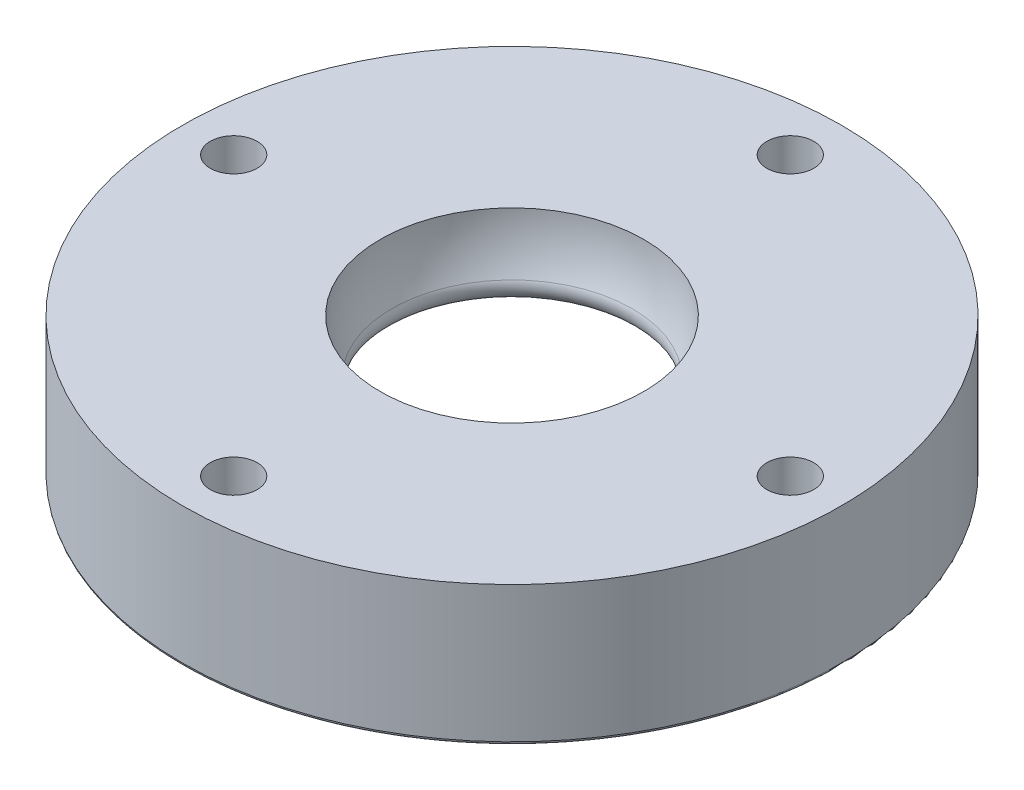
ISO-10303-21;
HEADER;
FILE_DESCRIPTION(('STEP AP214'),'2;1');
FILE_NAME('part.step','',(''),(''),'','','');
FILE_SCHEMA(('AUTOMOTIVE_DESIGN { 1 0 10303 214 1 1 1 1 }'));
ENDSEC;
DATA;
#1=APPLICATION_CONTEXT('core data for automotive mechanical design processes');
#2=APPLICATION_PROTOCOL_DEFINITION('international standard','automotive_design',2000,#1);
#3=PRODUCT_CONTEXT('',#1,'mechanical');
#4=PRODUCT('Part','Part','',(#3));
#5=PRODUCT_RELATED_PRODUCT_CATEGORY('part','',(#4));
#6=PRODUCT_DEFINITION_FORMATION('','',#4);
#7=PRODUCT_DEFINITION_CONTEXT('part definition',#1,'design');
#8=PRODUCT_DEFINITION('design','',#6,#7);
#9=PRODUCT_DEFINITION_SHAPE('','',#8);
#10=(LENGTH_UNIT() NAMED_UNIT(*) SI_UNIT(.MILLI.,.METRE.));
#11=(NAMED_UNIT(*) PLANE_ANGLE_UNIT() SI_UNIT($,.RADIAN.));
#12=(NAMED_UNIT(*) SI_UNIT($,.STERADIAN.) SOLID_ANGLE_UNIT());
#13=UNCERTAINTY_MEASURE_WITH_UNIT(LENGTH_MEASURE(1.E-05),#10,'distance_accuracy_value','');
#14=(GEOMETRIC_REPRESENTATION_CONTEXT(3) GLOBAL_UNCERTAINTY_ASSIGNED_CONTEXT((#13)) GLOBAL_UNIT_ASSIGNED_CONTEXT((#10,
#11,#12)) REPRESENTATION_CONTEXT('',''));
#15=CARTESIAN_POINT('',(0.,0.,0.));
#16=DIRECTION('',(0.,0.,1.));
#17=DIRECTION('',(1.,0.,0.));
#18=AXIS2_PLACEMENT_3D('',#15,#16,#17);
#19=CARTESIAN_POINT('',(0.,0.,0.));
#20=DIRECTION('',(0.,-1.,0.));
#21=DIRECTION('',(-1.,0.,0.));
#22=AXIS2_PLACEMENT_3D('',#19,#20,#21);
#23=SPHERICAL_SURFACE('',#22,9.);
#24=CARTESIAN_POINT('',(0.,-3.69802060357378,0.));
#25=DIRECTION('',(0.,1.,0.));
#26=DIRECTION('',(0.,0.,1.));
#27=AXIS2_PLACEMENT_3D('',#24,#25,#26);
#28=CIRCLE('',#27,8.20515957282635);
#29=CARTESIAN_POINT('',(0.,-3.69802060357378,8.20515957282635));
#30=VERTEX_POINT('',#29);
#31=EDGE_CURVE('E41',#30,#30,#28,.F.);
#32=ORIENTED_EDGE('',*,*,#31,.T.);
#33=EDGE_LOOP('',(#32));
#34=FACE_BOUND('',#33,.T.);
#35=CARTESIAN_POINT('',(0.,0.,0.));
#36=DIRECTION('',(0.,-1.,0.));
#37=DIRECTION('',(0.,0.,-1.));
#38=AXIS2_PLACEMENT_3D('',#35,#36,#37);
#39=CIRCLE('',#38,9.);
#40=CARTESIAN_POINT('',(0.,0.,-9.));
#41=VERTEX_POINT('',#40);
#42=EDGE_CURVE('E84',#41,#41,#39,.T.);
#43=ORIENTED_EDGE('',*,*,#42,.F.);
#44=EDGE_LOOP('',(#43));
#45=FACE_BOUND('',#44,.T.);
#46=ADVANCED_FACE('F34',(#34,#45),#23,.F.);
#47=CARTESIAN_POINT('',(0.,0.,0.));
#48=DIRECTION('',(0.,1.,0.));
#49=DIRECTION('',(0.,0.,1.));
#50=AXIS2_PLACEMENT_3D('',#47,#48,#49);
#51=PLANE('',#50);
#52=CARTESIAN_POINT('',(0.,0.,19.));
#53=DIRECTION('',(0.,1.,0.));
#54=DIRECTION('',(0.,0.,1.));
#55=AXIS2_PLACEMENT_3D('',#52,#53,#54);
#56=CIRCLE('',#55,1.6);
#57=CARTESIAN_POINT('',(0.,0.,20.6));
#58=VERTEX_POINT('',#57);
#59=EDGE_CURVE('E99',#58,#58,#56,.T.);
#60=ORIENTED_EDGE('',*,*,#59,.F.);
#61=EDGE_LOOP('',(#60));
#62=FACE_BOUND('',#61,.T.);
#63=CARTESIAN_POINT('',(19.,0.,0.));
#64=DIRECTION('',(0.,1.,0.));
#65=DIRECTION('',(0.,0.,1.));
#66=AXIS2_PLACEMENT_3D('',#63,#64,#65);
#67=CIRCLE('',#66,1.6);
#68=CARTESIAN_POINT('',(19.,0.,1.6));
#69=VERTEX_POINT('',#68);
#70=EDGE_CURVE('E96',#69,#69,#67,.T.);
#71=ORIENTED_EDGE('',*,*,#70,.F.);
#72=EDGE_LOOP('',(#71));
#73=FACE_BOUND('',#72,.T.);
#74=CARTESIAN_POINT('',(0.,0.,-19.));
#75=DIRECTION('',(0.,1.,0.));
#76=DIRECTION('',(0.,0.,1.));
#77=AXIS2_PLACEMENT_3D('',#74,#75,#76);
#78=CIRCLE('',#77,1.6);
#79=CARTESIAN_POINT('',(0.,0.,-17.4));
#80=VERTEX_POINT('',#79);
#81=EDGE_CURVE('E93',#80,#80,#78,.T.);
#82=ORIENTED_EDGE('',*,*,#81,.F.);
#83=EDGE_LOOP('',(#82));
#84=FACE_BOUND('',#83,.T.);
#85=CARTESIAN_POINT('',(-19.,0.,0.));
#86=DIRECTION('',(0.,1.,0.));
#87=DIRECTION('',(0.,0.,1.));
#88=AXIS2_PLACEMENT_3D('',#85,#86,#87);
#89=CIRCLE('',#88,1.6);
#90=CARTESIAN_POINT('',(-19.,0.,1.6));
#91=VERTEX_POINT('',#90);
#92=EDGE_CURVE('E90',#91,#91,#89,.T.);
#93=ORIENTED_EDGE('',*,*,#92,.F.);
#94=EDGE_LOOP('',(#93));
#95=FACE_BOUND('',#94,.T.);
#96=ORIENTED_EDGE('',*,*,#42,.T.);
#97=EDGE_LOOP('',(#96));
#98=FACE_BOUND('',#97,.T.);
#99=CARTESIAN_POINT('',(0.,0.,0.));
#100=DIRECTION('',(0.,-1.,0.));
#101=DIRECTION('',(0.,0.,-1.));
#102=AXIS2_PLACEMENT_3D('',#99,#100,#101);
#103=CIRCLE('',#102,22.5);
#104=CARTESIAN_POINT('',(0.,0.,-22.5));
#105=VERTEX_POINT('',#104);
#106=EDGE_CURVE('E87',#105,#105,#103,.T.);
#107=ORIENTED_EDGE('',*,*,#106,.F.);
#108=EDGE_LOOP('',(#107));
#109=FACE_BOUND('',#108,.T.);
#110=ADVANCED_FACE('F105',(#62,#73,#84,#95,#98,#109),#51,.T.);
#111=CARTESIAN_POINT('',(0.,0.,0.));
#112=DIRECTION('',(0.,-1.,0.));
#113=DIRECTION('',(0.,0.,-1.));
#114=AXIS2_PLACEMENT_3D('',#111,#112,#113);
#115=CYLINDRICAL_SURFACE('',#114,22.5);
#116=CARTESIAN_POINT('',(0.,-9.29999999999998,0.));
#117=DIRECTION('',(0.,-1.,0.));
#118=DIRECTION('',(0.,0.,-1.));
#119=AXIS2_PLACEMENT_3D('',#116,#117,#118);
#120=CIRCLE('',#119,22.5);
#121=CARTESIAN_POINT('',(0.,-9.29999999999998,-22.5));
#122=VERTEX_POINT('',#121);
#123=EDGE_CURVE('E60',#122,#122,#120,.F.);
#124=ORIENTED_EDGE('',*,*,#123,.T.);
#125=EDGE_LOOP('',(#124));
#126=FACE_BOUND('',#125,.T.);
#127=ORIENTED_EDGE('',*,*,#106,.T.);
#128=EDGE_LOOP('',(#127));
#129=FACE_BOUND('',#128,.T.);
#130=ADVANCED_FACE('F108',(#126,#129),#115,.T.);
#131=CARTESIAN_POINT('',(0.,-9.49999999999998,0.));
#132=DIRECTION('',(0.,-1.,0.));
#133=DIRECTION('',(0.,0.,-1.));
#134=AXIS2_PLACEMENT_3D('',#131,#132,#133);
#135=PLANE('',#134);
#136=CARTESIAN_POINT('',(0.,-9.49999999999998,0.));
#137=DIRECTION('',(0.,-1.,0.));
#138=DIRECTION('',(0.,0.,-1.));
#139=AXIS2_PLACEMENT_3D('',#136,#137,#138);
#140=CIRCLE('',#139,16.5080725103906);
#141=CARTESIAN_POINT('',(0.,-9.49999999999998,-16.5080725103906));
#142=VERTEX_POINT('',#141);
#143=EDGE_CURVE('E63',#142,#142,#140,.F.);
#144=ORIENTED_EDGE('',*,*,#143,.T.);
#145=EDGE_LOOP('',(#144));
#146=FACE_BOUND('',#145,.T.);
#147=CARTESIAN_POINT('',(0.,-9.49999999999998,0.));
#148=DIRECTION('',(0.,-1.,0.));
#149=DIRECTION('',(0.,0.,-1.));
#150=AXIS2_PLACEMENT_3D('',#147,#148,#149);
#151=CIRCLE('',#150,22.3);
#152=CARTESIAN_POINT('',(0.,-9.49999999999998,-22.3));
#153=VERTEX_POINT('',#152);
#154=EDGE_CURVE('E66',#153,#153,#151,.T.);
#155=ORIENTED_EDGE('',*,*,#154,.T.);
#156=EDGE_LOOP('',(#155));
#157=FACE_BOUND('',#156,.T.);
#158=CARTESIAN_POINT('',(-19.,-9.49999999999998,0.));
#159=DIRECTION('',(0.,-1.,0.));
#160=DIRECTION('',(0.,0.,-1.));
#161=AXIS2_PLACEMENT_3D('',#158,#159,#160);
#162=CIRCLE('',#161,1.8);
#163=CARTESIAN_POINT('',(-19.,-9.49999999999998,-1.8));
#164=VERTEX_POINT('',#163);
#165=EDGE_CURVE('E69',#164,#164,#162,.F.);
#166=ORIENTED_EDGE('',*,*,#165,.T.);
#167=EDGE_LOOP('',(#166));
#168=FACE_BOUND('',#167,.T.);
#169=CARTESIAN_POINT('',(0.,-9.49999999999998,-19.));
#170=DIRECTION('',(0.,-1.,0.));
#171=DIRECTION('',(0.,0.,-1.));
#172=AXIS2_PLACEMENT_3D('',#169,#170,#171);
#173=CIRCLE('',#172,1.8);
#174=CARTESIAN_POINT('',(0.,-9.49999999999998,-20.8));
#175=VERTEX_POINT('',#174);
#176=EDGE_CURVE('E72',#175,#175,#173,.F.);
#177=ORIENTED_EDGE('',*,*,#176,.T.);
#178=EDGE_LOOP('',(#177));
#179=FACE_BOUND('',#178,.T.);
#180=CARTESIAN_POINT('',(19.,-9.49999999999998,0.));
#181=DIRECTION('',(0.,-1.,0.));
#182=DIRECTION('',(0.,0.,-1.));
#183=AXIS2_PLACEMENT_3D('',#180,#181,#182);
#184=CIRCLE('',#183,1.8);
#185=CARTESIAN_POINT('',(19.,-9.49999999999998,-1.8));
#186=VERTEX_POINT('',#185);
#187=EDGE_CURVE('E75',#186,#186,#184,.F.);
#188=ORIENTED_EDGE('',*,*,#187,.T.);
#189=EDGE_LOOP('',(#188));
#190=FACE_BOUND('',#189,.T.);
#191=CARTESIAN_POINT('',(0.,-9.49999999999998,19.));
#192=DIRECTION('',(0.,-1.,0.));
#193=DIRECTION('',(0.,0.,-1.));
#194=AXIS2_PLACEMENT_3D('',#191,#192,#193);
#195=CIRCLE('',#194,1.8);
#196=CARTESIAN_POINT('',(0.,-9.49999999999998,17.2));
#197=VERTEX_POINT('',#196);
#198=EDGE_CURVE('E78',#197,#197,#195,.F.);
#199=ORIENTED_EDGE('',*,*,#198,.T.);
#200=EDGE_LOOP('',(#199));
#201=FACE_BOUND('',#200,.T.);
#202=ADVANCED_FACE('F121',(#146,#157,#168,#179,#190,#201),#135,.T.);
#203=CARTESIAN_POINT('',(0.,-4.49999999999998,0.));
#204=DIRECTION('',(0.,-1.,0.));
#205=DIRECTION('',(0.,0.,-1.));
#206=AXIS2_PLACEMENT_3D('',#203,#204,#205);
#207=CONICAL_SURFACE('',#206,7.79422863405996,1.0471975511966);
#208=CARTESIAN_POINT('',(0.,-4.97493718553308,0.));
#209=DIRECTION('',(0.,1.,0.));
#210=DIRECTION('',(0.,0.,1.));
#211=AXIS2_PLACEMENT_3D('',#208,#209,#210);
#212=CIRCLE('',#211,8.61684396980706);
#213=CARTESIAN_POINT('',(0.,-4.97493718553308,8.61684396980706));
#214=VERTEX_POINT('',#213);
#215=EDGE_CURVE('E10',#214,#214,#212,.T.);
#216=ORIENTED_EDGE('',*,*,#215,.T.);
#217=EDGE_LOOP('',(#216));
#218=FACE_BOUND('',#217,.T.);
#219=CARTESIAN_POINT('',(0.,-9.47320508075687,0.));
#220=DIRECTION('',(0.,1.,0.));
#221=DIRECTION('',(0.,0.,1.));
#222=AXIS2_PLACEMENT_3D('',#219,#220,#221);
#223=CIRCLE('',#222,16.4080725103906);
#224=CARTESIAN_POINT('',(0.,-9.47320508075687,16.4080725103906));
#225=VERTEX_POINT('',#224);
#226=EDGE_CURVE('E81',#225,#225,#223,.F.);
#227=ORIENTED_EDGE('',*,*,#226,.T.);
#228=EDGE_LOOP('',(#227));
#229=FACE_BOUND('',#228,.T.);
#230=ADVANCED_FACE('F127',(#218,#229),#207,.F.);
#231=CARTESIAN_POINT('',(-19.,-10.,0.));
#232=DIRECTION('',(0.,1.,0.));
#233=DIRECTION('',(0.,0.,1.));
#234=AXIS2_PLACEMENT_3D('',#231,#232,#233);
#235=CYLINDRICAL_SURFACE('',#234,1.6);
#236=CARTESIAN_POINT('',(-19.,-9.29999999999998,0.));
#237=DIRECTION('',(0.,-1.,0.));
#238=DIRECTION('',(0.,0.,-1.));
#239=AXIS2_PLACEMENT_3D('',#236,#237,#238);
#240=CIRCLE('',#239,1.6);
#241=CARTESIAN_POINT('',(-19.,-9.29999999999998,-1.6));
#242=VERTEX_POINT('',#241);
#243=EDGE_CURVE('E57',#242,#242,#240,.T.);
#244=ORIENTED_EDGE('',*,*,#243,.T.);
#245=EDGE_LOOP('',(#244));
#246=FACE_BOUND('',#245,.T.);
#247=ORIENTED_EDGE('',*,*,#92,.T.);
#248=EDGE_LOOP('',(#247));
#249=FACE_BOUND('',#248,.T.);
#250=ADVANCED_FACE('F178',(#246,#249),#235,.F.);
#251=CARTESIAN_POINT('',(0.,-10.,-19.));
#252=DIRECTION('',(0.,1.,0.));
#253=DIRECTION('',(0.,0.,1.));
#254=AXIS2_PLACEMENT_3D('',#251,#252,#253);
#255=CYLINDRICAL_SURFACE('',#254,1.6);
#256=CARTESIAN_POINT('',(0.,-9.29999999999998,-19.));
#257=DIRECTION('',(0.,-1.,0.));
#258=DIRECTION('',(0.,0.,-1.));
#259=AXIS2_PLACEMENT_3D('',#256,#257,#258);
#260=CIRCLE('',#259,1.6);
#261=CARTESIAN_POINT('',(0.,-9.29999999999998,-20.6));
#262=VERTEX_POINT('',#261);
#263=EDGE_CURVE('E54',#262,#262,#260,.T.);
#264=ORIENTED_EDGE('',*,*,#263,.T.);
#265=EDGE_LOOP('',(#264));
#266=FACE_BOUND('',#265,.T.);
#267=ORIENTED_EDGE('',*,*,#81,.T.);
#268=EDGE_LOOP('',(#267));
#269=FACE_BOUND('',#268,.T.);
#270=ADVANCED_FACE('F172',(#266,#269),#255,.F.);
#271=CARTESIAN_POINT('',(19.,-10.,0.));
#272=DIRECTION('',(0.,1.,0.));
#273=DIRECTION('',(0.,0.,1.));
#274=AXIS2_PLACEMENT_3D('',#271,#272,#273);
#275=CYLINDRICAL_SURFACE('',#274,1.6);
#276=CARTESIAN_POINT('',(19.,-9.29999999999998,0.));
#277=DIRECTION('',(0.,-1.,0.));
#278=DIRECTION('',(0.,0.,-1.));
#279=AXIS2_PLACEMENT_3D('',#276,#277,#278);
#280=CIRCLE('',#279,1.6);
#281=CARTESIAN_POINT('',(19.,-9.29999999999998,-1.6));
#282=VERTEX_POINT('',#281);
#283=EDGE_CURVE('E49',#282,#282,#280,.T.);
#284=ORIENTED_EDGE('',*,*,#283,.T.);
#285=EDGE_LOOP('',(#284));
#286=FACE_BOUND('',#285,.T.);
#287=ORIENTED_EDGE('',*,*,#70,.T.);
#288=EDGE_LOOP('',(#287));
#289=FACE_BOUND('',#288,.T.);
#290=ADVANCED_FACE('F167',(#286,#289),#275,.F.);
#291=CARTESIAN_POINT('',(0.,-10.,19.));
#292=DIRECTION('',(0.,1.,0.));
#293=DIRECTION('',(0.,0.,1.));
#294=AXIS2_PLACEMENT_3D('',#291,#292,#293);
#295=CYLINDRICAL_SURFACE('',#294,1.6);
#296=CARTESIAN_POINT('',(0.,-9.29999999999998,19.));
#297=DIRECTION('',(0.,-1.,0.));
#298=DIRECTION('',(0.,0.,-1.));
#299=AXIS2_PLACEMENT_3D('',#296,#297,#298);
#300=CIRCLE('',#299,1.6);
#301=CARTESIAN_POINT('',(0.,-9.29999999999998,17.4));
#302=VERTEX_POINT('',#301);
#303=EDGE_CURVE('E45',#302,#302,#300,.T.);
#304=ORIENTED_EDGE('',*,*,#303,.T.);
#305=EDGE_LOOP('',(#304));
#306=FACE_BOUND('',#305,.T.);
#307=ORIENTED_EDGE('',*,*,#59,.T.);
#308=EDGE_LOOP('',(#307));
#309=FACE_BOUND('',#308,.T.);
#310=ADVANCED_FACE('F103',(#306,#309),#295,.F.);
#311=CARTESIAN_POINT('',(0.,-9.29999999999998,0.));
#312=DIRECTION('',(0.,-1.,0.));
#313=DIRECTION('',(0.,0.,-1.));
#314=AXIS2_PLACEMENT_3D('',#311,#312,#313);
#315=TOROIDAL_SURFACE('',#314,16.5080725103906,0.2);
#316=ORIENTED_EDGE('',*,*,#143,.F.);
#317=EDGE_LOOP('',(#316));
#318=FACE_BOUND('',#317,.T.);
#319=ORIENTED_EDGE('',*,*,#226,.F.);
#320=EDGE_LOOP('',(#319));
#321=FACE_BOUND('',#320,.T.);
#322=ADVANCED_FACE('F136',(#318,#321),#315,.T.);
#323=CARTESIAN_POINT('',(0.,-9.29999999999998,0.));
#324=DIRECTION('',(0.,-1.,0.));
#325=DIRECTION('',(0.,0.,-1.));
#326=AXIS2_PLACEMENT_3D('',#323,#324,#325);
#327=TOROIDAL_SURFACE('',#326,22.3,0.2);
#328=ORIENTED_EDGE('',*,*,#123,.F.);
#329=EDGE_LOOP('',(#328));
#330=FACE_BOUND('',#329,.T.);
#331=ORIENTED_EDGE('',*,*,#154,.F.);
#332=EDGE_LOOP('',(#331));
#333=FACE_BOUND('',#332,.T.);
#334=ADVANCED_FACE('F139',(#330,#333),#327,.T.);
#335=CARTESIAN_POINT('',(-19.,-9.29999999999998,0.));
#336=DIRECTION('',(0.,-1.,0.));
#337=DIRECTION('',(0.,0.,-1.));
#338=AXIS2_PLACEMENT_3D('',#335,#336,#337);
#339=TOROIDAL_SURFACE('',#338,1.8,0.2);
#340=ORIENTED_EDGE('',*,*,#165,.F.);
#341=EDGE_LOOP('',(#340));
#342=FACE_BOUND('',#341,.T.);
#343=ORIENTED_EDGE('',*,*,#243,.F.);
#344=EDGE_LOOP('',(#343));
#345=FACE_BOUND('',#344,.T.);
#346=ADVANCED_FACE('F143',(#342,#345),#339,.T.);
#347=CARTESIAN_POINT('',(0.,-9.29999999999998,-19.));
#348=DIRECTION('',(0.,-1.,0.));
#349=DIRECTION('',(0.,0.,-1.));
#350=AXIS2_PLACEMENT_3D('',#347,#348,#349);
#351=TOROIDAL_SURFACE('',#350,1.8,0.2);
#352=ORIENTED_EDGE('',*,*,#176,.F.);
#353=EDGE_LOOP('',(#352));
#354=FACE_BOUND('',#353,.T.);
#355=ORIENTED_EDGE('',*,*,#263,.F.);
#356=EDGE_LOOP('',(#355));
#357=FACE_BOUND('',#356,.T.);
#358=ADVANCED_FACE('F147',(#354,#357),#351,.T.);
#359=CARTESIAN_POINT('',(19.,-9.29999999999998,0.));
#360=DIRECTION('',(0.,-1.,0.));
#361=DIRECTION('',(0.,0.,-1.));
#362=AXIS2_PLACEMENT_3D('',#359,#360,#361);
#363=TOROIDAL_SURFACE('',#362,1.8,0.2);
#364=ORIENTED_EDGE('',*,*,#187,.F.);
#365=EDGE_LOOP('',(#364));
#366=FACE_BOUND('',#365,.T.);
#367=ORIENTED_EDGE('',*,*,#283,.F.);
#368=EDGE_LOOP('',(#367));
#369=FACE_BOUND('',#368,.T.);
#370=ADVANCED_FACE('F151',(#366,#369),#363,.T.);
#371=CARTESIAN_POINT('',(0.,-9.29999999999998,19.));
#372=DIRECTION('',(0.,-1.,0.));
#373=DIRECTION('',(0.,0.,-1.));
#374=AXIS2_PLACEMENT_3D('',#371,#372,#373);
#375=TOROIDAL_SURFACE('',#374,1.8,0.2);
#376=ORIENTED_EDGE('',*,*,#198,.F.);
#377=EDGE_LOOP('',(#376));
#378=FACE_BOUND('',#377,.T.);
#379=ORIENTED_EDGE('',*,*,#303,.F.);
#380=EDGE_LOOP('',(#379));
#381=FACE_BOUND('',#380,.T.);
#382=ADVANCED_FACE('F154',(#378,#381),#375,.T.);
#383=CARTESIAN_POINT('',(0.,-4.10891178174864,0.));
#384=DIRECTION('',(0.,1.,0.));
#385=DIRECTION('',(0.,0.,1.));
#386=AXIS2_PLACEMENT_3D('',#383,#384,#385);
#387=TOROIDAL_SURFACE('',#386,9.11684396980705,1.);
#388=ORIENTED_EDGE('',*,*,#215,.F.);
#389=EDGE_LOOP('',(#388));
#390=FACE_BOUND('',#389,.T.);
#391=ORIENTED_EDGE('',*,*,#31,.F.);
#392=EDGE_LOOP('',(#391));
#393=FACE_BOUND('',#392,.T.);
#394=ADVANCED_FACE('F36',(#390,#393),#387,.T.);
#395=CLOSED_SHELL('',(#46,#110,#130,#202,#230,#250,#270,#290,#310,#322,#334,#346,#358,#370,#382,#394));
#396=MANIFOLD_SOLID_BREP('B2',#395);
#397=ADVANCED_BREP_SHAPE_REPRESENTATION('',(#18,#396),#14);
#398=SHAPE_DEFINITION_REPRESENTATION(#9,#397);
ENDSEC;
END-ISO-10303-21;
